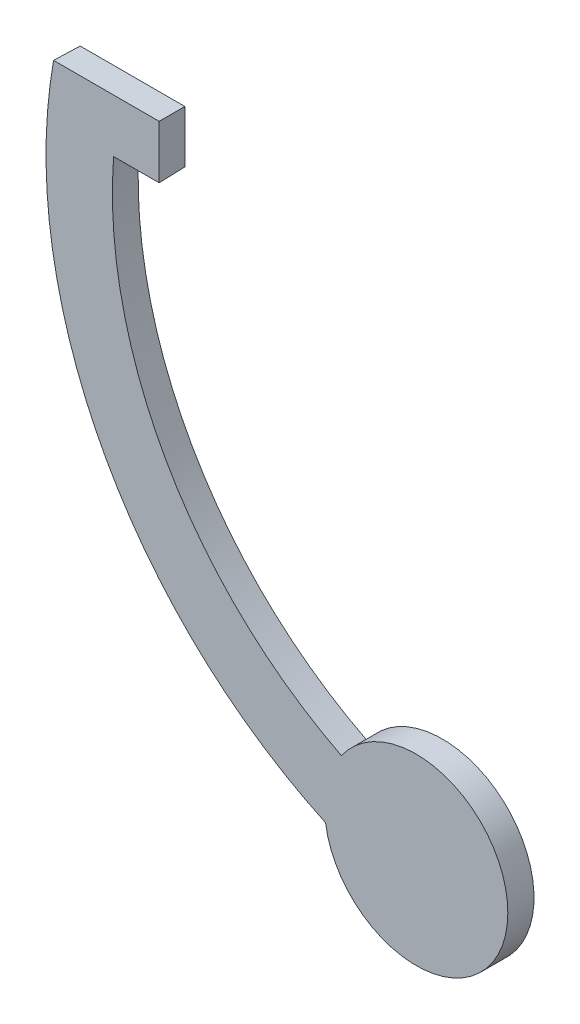
ISO-10303-21;
HEADER;
FILE_DESCRIPTION(('STEP AP214'),'2;1');
FILE_NAME('part.step','',(''),(''),'','','');
FILE_SCHEMA(('AUTOMOTIVE_DESIGN { 1 0 10303 214 1 1 1 1 }'));
ENDSEC;
DATA;
#1=APPLICATION_CONTEXT('core data for automotive mechanical design processes');
#2=APPLICATION_PROTOCOL_DEFINITION('international standard','automotive_design',2000,#1);
#3=PRODUCT_CONTEXT('',#1,'mechanical');
#4=PRODUCT('Part','Part','',(#3));
#5=PRODUCT_RELATED_PRODUCT_CATEGORY('part','',(#4));
#6=PRODUCT_DEFINITION_FORMATION('','',#4);
#7=PRODUCT_DEFINITION_CONTEXT('part definition',#1,'design');
#8=PRODUCT_DEFINITION('design','',#6,#7);
#9=PRODUCT_DEFINITION_SHAPE('','',#8);
#10=(LENGTH_UNIT() NAMED_UNIT(*) SI_UNIT(.MILLI.,.METRE.));
#11=(NAMED_UNIT(*) PLANE_ANGLE_UNIT() SI_UNIT($,.RADIAN.));
#12=(NAMED_UNIT(*) SI_UNIT($,.STERADIAN.) SOLID_ANGLE_UNIT());
#13=UNCERTAINTY_MEASURE_WITH_UNIT(LENGTH_MEASURE(1.E-05),#10,'distance_accuracy_value','');
#14=(GEOMETRIC_REPRESENTATION_CONTEXT(3) GLOBAL_UNCERTAINTY_ASSIGNED_CONTEXT((#13)) GLOBAL_UNIT_ASSIGNED_CONTEXT((#10,
#11,#12)) REPRESENTATION_CONTEXT('',''));
#15=CARTESIAN_POINT('',(0.,0.,0.));
#16=DIRECTION('',(0.,0.,1.));
#17=DIRECTION('',(1.,0.,0.));
#18=AXIS2_PLACEMENT_3D('',#15,#16,#17);
#19=CARTESIAN_POINT('',(0.,0.,2.));
#20=DIRECTION('',(0.,0.,-1.));
#21=DIRECTION('',(-1.,0.,0.));
#22=AXIS2_PLACEMENT_3D('',#19,#20,#21);
#23=CYLINDRICAL_SURFACE('',#22,7.);
#24=CARTESIAN_POINT('',(-5.71587016019037,4.04089449402547,2.0102));
#25=CARTESIAN_POINT('',(-5.71929976298552,4.03604328976432,1.67346670640016));
#26=CARTESIAN_POINT('',(-5.72272253548083,4.03118865982949,1.33673339293358));
#27=CARTESIAN_POINT('',(-5.72955441987175,4.02147254861247,0.66326672626691));
#28=CARTESIAN_POINT('',(-5.73296353176736,4.01661106733029,0.326533373066829));
#29=CARTESIAN_POINT('',(-5.73636581336312,4.01174616037442,-0.0102));
#30=B_SPLINE_CURVE_WITH_KNOTS('',3,(#24,#25,#26,#27,#28,#29),.UNSPECIFIED.,.F.,.F.,(4,2,4),(0.,
1.01035709767087,2.02071419534174),.UNSPECIFIED.);
#31=CARTESIAN_POINT('',(-5.71597404449651,4.04074754502706,2.));
#32=VERTEX_POINT('',#31);
#33=CARTESIAN_POINT('',(-5.73626275249213,4.01189352231232,0.));
#34=VERTEX_POINT('',#33);
#35=EDGE_CURVE('E103',#32,#34,#30,.T.);
#36=ORIENTED_EDGE('',*,*,#35,.F.);
#37=CARTESIAN_POINT('',(0.,0.,2.));
#38=DIRECTION('',(0.,0.,1.));
#39=DIRECTION('',(1.,0.,0.));
#40=AXIS2_PLACEMENT_3D('',#37,#38,#39);
#41=CIRCLE('',#40,7.);
#42=CARTESIAN_POINT('',(-6.9271267917892,-1.00742960571765,2.));
#43=VERTEX_POINT('',#42);
#44=EDGE_CURVE('E11',#32,#43,#41,.F.);
#45=ORIENTED_EDGE('',*,*,#44,.T.);
#46=CARTESIAN_POINT('',(-6.93303358857163,-0.965942679322959,-0.0101999999999998));
#47=CARTESIAN_POINT('',(-6.93206666226335,-0.972883041953001,0.326533590941589));
#48=CARTESIAN_POINT('',(-6.93108841112014,-0.979828033017703,0.663267053079047));
#49=CARTESIAN_POINT('',(-6.92910925916386,-0.993727272016424,1.33673371974571));
#50=CARTESIAN_POINT('',(-6.92810835835079,-1.00068151995044,1.67346692427492));
#51=CARTESIAN_POINT('',(-6.92709613270279,-1.00764039631912,2.0102));
#52=B_SPLINE_CURVE_WITH_KNOTS('',3,(#46,#47,#48,#49,#50,#51),.UNSPECIFIED.,.F.,.F.,(4,2,4),(0.,
1.01041948199419,2.02083896398841),.UNSPECIFIED.);
#53=CARTESIAN_POINT('',(-6.93300429477321,-0.966152911632712,0.));
#54=VERTEX_POINT('',#53);
#55=EDGE_CURVE('E92',#54,#43,#52,.T.);
#56=ORIENTED_EDGE('',*,*,#55,.F.);
#57=CARTESIAN_POINT('',(0.,0.,0.));
#58=DIRECTION('',(0.,0.,1.));
#59=DIRECTION('',(1.,0.,0.));
#60=AXIS2_PLACEMENT_3D('',#57,#58,#59);
#61=CIRCLE('',#60,7.);
#62=EDGE_CURVE('E39',#34,#54,#61,.F.);
#63=ORIENTED_EDGE('',*,*,#62,.F.);
#64=EDGE_LOOP('',(#36,#45,#56,#63));
#65=FACE_BOUND('',#64,.T.);
#66=ADVANCED_FACE('F35',(#65),#23,.T.);
#67=CARTESIAN_POINT('',(0.,0.,2.));
#68=DIRECTION('',(0.,0.,1.));
#69=DIRECTION('',(1.,0.,0.));
#70=AXIS2_PLACEMENT_3D('',#67,#68,#69);
#71=PLANE('',#70);
#72=ORIENTED_EDGE('',*,*,#44,.F.);
#73=CARTESIAN_POINT('',(8.72574402118636,32.5283518673079,2.));
#74=DIRECTION('',(0.,0.,-1.));
#75=DIRECTION('',(-1.,0.,0.));
#76=AXIS2_PLACEMENT_3D('',#73,#74,#75);
#77=CIRCLE('',#76,31.9391111446688);
#78=CARTESIAN_POINT('',(-23.1193658760264,34.9769833924559,2.));
#79=VERTEX_POINT('',#78);
#80=EDGE_CURVE('E57',#79,#32,#77,.F.);
#81=ORIENTED_EDGE('',*,*,#80,.F.);
#82=DIRECTION('',(-1.,0.,0.));
#83=VECTOR('',#82,1.);
#84=CARTESIAN_POINT('',(0.,34.9769833924559,2.));
#85=LINE('',#84,#83);
#86=CARTESIAN_POINT('',(-19.6404713372833,34.9769833924559,2.));
#87=VERTEX_POINT('',#86);
#88=EDGE_CURVE('E226',#87,#79,#85,.T.);
#89=ORIENTED_EDGE('',*,*,#88,.F.);
#90=DIRECTION('',(0.,-1.,0.));
#91=VECTOR('',#90,1.);
#92=CARTESIAN_POINT('',(-19.6404713372833,0.,2.));
#93=LINE('',#92,#91);
#94=CARTESIAN_POINT('',(-19.6404713372833,39.0468036521688,2.));
#95=VERTEX_POINT('',#94);
#96=EDGE_CURVE('E223',#95,#87,#93,.T.);
#97=ORIENTED_EDGE('',*,*,#96,.F.);
#98=DIRECTION('',(1.,0.,0.));
#99=VECTOR('',#98,1.);
#100=CARTESIAN_POINT('',(0.,39.0468036521688,2.));
#101=LINE('',#100,#99);
#102=CARTESIAN_POINT('',(-27.7046113163981,39.0468036521688,2.));
#103=VERTEX_POINT('',#102);
#104=EDGE_CURVE('E227',#103,#95,#101,.T.);
#105=ORIENTED_EDGE('',*,*,#104,.F.);
#106=CARTESIAN_POINT('',(8.72574402118636,32.5283518673079,2.));
#107=DIRECTION('',(0.,0.,-1.));
#108=DIRECTION('',(-1.,0.,0.));
#109=AXIS2_PLACEMENT_3D('',#106,#107,#108);
#110=CIRCLE('',#109,37.0089314043816);
#111=EDGE_CURVE('E215',#43,#103,#110,.T.);
#112=ORIENTED_EDGE('',*,*,#111,.F.);
#113=EDGE_LOOP('',(#72,#81,#89,#97,#105,#112));
#114=FACE_BOUND('',#113,.T.);
#115=ADVANCED_FACE('F147',(#114),#71,.T.);
#116=CARTESIAN_POINT('',(0.,0.,0.));
#117=DIRECTION('',(0.,0.,1.));
#118=DIRECTION('',(1.,0.,0.));
#119=AXIS2_PLACEMENT_3D('',#116,#117,#118);
#120=PLANE('',#119);
#121=ORIENTED_EDGE('',*,*,#62,.T.);
#122=CARTESIAN_POINT('',(8.72574402118636,32.5283518673079,0.));
#123=DIRECTION('',(0.,0.,-1.));
#124=DIRECTION('',(-1.,0.,0.));
#125=AXIS2_PLACEMENT_3D('',#122,#123,#124);
#126=CIRCLE('',#125,36.9740212745252);
#127=CARTESIAN_POINT('',(-27.6753814671398,39.0118935223123,0.));
#128=VERTEX_POINT('',#127);
#129=EDGE_CURVE('E89',#54,#128,#126,.T.);
#130=ORIENTED_EDGE('',*,*,#129,.T.);
#131=DIRECTION('',(1.,0.,0.));
#132=VECTOR('',#131,1.);
#133=CARTESIAN_POINT('',(-27.6753814671398,39.0118935223123,0.));
#134=LINE('',#133,#132);
#135=CARTESIAN_POINT('',(-19.6753814671398,39.0118935223123,0.));
#136=VERTEX_POINT('',#135);
#137=EDGE_CURVE('E98',#128,#136,#134,.T.);
#138=ORIENTED_EDGE('',*,*,#137,.T.);
#139=DIRECTION('',(0.,-1.,0.));
#140=VECTOR('',#139,1.);
#141=CARTESIAN_POINT('',(-19.6753814671398,39.0118935223123,0.));
#142=LINE('',#141,#140);
#143=CARTESIAN_POINT('',(-19.6753814671398,35.0118935223123,0.));
#144=VERTEX_POINT('',#143);
#145=EDGE_CURVE('E208',#136,#144,#142,.T.);
#146=ORIENTED_EDGE('',*,*,#145,.T.);
#147=DIRECTION('',(-1.,0.,0.));
#148=VECTOR('',#147,1.);
#149=CARTESIAN_POINT('',(-19.6753814671398,35.0118935223123,0.));
#150=LINE('',#149,#148);
#151=CARTESIAN_POINT('',(-23.1516783544018,35.0118935223123,0.));
#152=VERTEX_POINT('',#151);
#153=EDGE_CURVE('E210',#144,#152,#150,.T.);
#154=ORIENTED_EDGE('',*,*,#153,.T.);
#155=CARTESIAN_POINT('',(8.72574402118636,32.5283518673079,0.));
#156=DIRECTION('',(0.,0.,1.));
#157=DIRECTION('',(1.,0.,0.));
#158=AXIS2_PLACEMENT_3D('',#155,#156,#157);
#159=CIRCLE('',#158,31.9740212745252);
#160=EDGE_CURVE('E50',#152,#34,#159,.T.);
#161=ORIENTED_EDGE('',*,*,#160,.T.);
#162=EDGE_LOOP('',(#121,#130,#138,#146,#154,#161));
#163=FACE_BOUND('',#162,.T.);
#164=ADVANCED_FACE('F106',(#163),#120,.F.);
#165=CARTESIAN_POINT('',(8.72574402118636,32.5283518673079,0.));
#166=DIRECTION('',(0.,0.,-1.));
#167=DIRECTION('',(1.,0.,0.));
#168=AXIS2_PLACEMENT_3D('',#165,#166,#167);
#169=CONICAL_SURFACE('',#168,31.9740212745252,0.0174532925199432);
#170=ORIENTED_EDGE('',*,*,#80,.T.);
#171=ORIENTED_EDGE('',*,*,#35,.T.);
#172=ORIENTED_EDGE('',*,*,#160,.F.);
#173=CARTESIAN_POINT('',(-23.1193658760264,34.9769833924559,2.));
#174=CARTESIAN_POINT('',(-23.1247540192164,34.9828017466623,1.66666671076182));
#175=CARTESIAN_POINT('',(-23.1301407973427,34.9886201012535,1.33333339947606));
#176=CARTESIAN_POINT('',(-23.1409116234679,35.0002568112056,0.666666732809397));
#177=CARTESIAN_POINT('',(-23.1462956714667,35.0060751665666,0.333333377428488));
#178=CARTESIAN_POINT('',(-23.1516783544018,35.0118935223123,0.));
#179=B_SPLINE_CURVE_WITH_KNOTS('',3,(#173,#174,#175,#176,#177,#178),.UNSPECIFIED.,.F.,.F.,(4,2,
4),(0.,1.00028281169534,2.00056562339066),.UNSPECIFIED.);
#180=EDGE_CURVE('E104',#79,#152,#179,.T.);
#181=ORIENTED_EDGE('',*,*,#180,.F.);
#182=EDGE_LOOP('',(#170,#171,#172,#181));
#183=FACE_BOUND('',#182,.T.);
#184=ADVANCED_FACE('F119',(#183),#169,.F.);
#185=CARTESIAN_POINT('',(-19.6753814671398,35.0118935223123,0.));
#186=DIRECTION('',(0.,-0.999847695156391,-0.0174524064372835));
#187=DIRECTION('',(0.,0.0174524064372835,-0.999847695156391));
#188=AXIS2_PLACEMENT_3D('',#185,#186,#187);
#189=PLANE('',#188);
#190=ORIENTED_EDGE('',*,*,#153,.F.);
#191=DIRECTION('',(-0.0174497491606826,0.0174497491606826,-0.999695459881887));
#192=VECTOR('',#191,1.);
#193=CARTESIAN_POINT('',(-19.6765994421228,35.0131114972954,-0.0697777400480487));
#194=LINE('',#193,#192);
#195=EDGE_CURVE('E134',#87,#144,#194,.T.);
#196=ORIENTED_EDGE('',*,*,#195,.F.);
#197=ORIENTED_EDGE('',*,*,#88,.T.);
#198=ORIENTED_EDGE('',*,*,#180,.T.);
#199=EDGE_LOOP('',(#190,#196,#197,#198));
#200=FACE_BOUND('',#199,.T.);
#201=ADVANCED_FACE('F122',(#200),#189,.T.);
#202=CARTESIAN_POINT('',(-19.6753814671398,39.0118935223123,0.));
#203=DIRECTION('',(0.999847695156391,0.,-0.0174524064372835));
#204=DIRECTION('',(-0.0174524064372835,0.,-0.999847695156391));
#205=AXIS2_PLACEMENT_3D('',#202,#203,#204);
#206=PLANE('',#205);
#207=ORIENTED_EDGE('',*,*,#145,.F.);
#208=DIRECTION('',(-0.0174497491606826,-0.0174497491606826,-0.999695459881887));
#209=VECTOR('',#208,1.);
#210=CARTESIAN_POINT('',(-19.6778174171059,39.0094575723462,-0.139555480096098));
#211=LINE('',#210,#209);
#212=EDGE_CURVE('E205',#95,#136,#211,.T.);
#213=ORIENTED_EDGE('',*,*,#212,.F.);
#214=ORIENTED_EDGE('',*,*,#96,.T.);
#215=ORIENTED_EDGE('',*,*,#195,.T.);
#216=EDGE_LOOP('',(#207,#213,#214,#215));
#217=FACE_BOUND('',#216,.T.);
#218=ADVANCED_FACE('F140',(#217),#206,.T.);
#219=CARTESIAN_POINT('',(-27.6753814671398,39.0118935223123,0.));
#220=DIRECTION('',(0.,0.999847695156391,-0.0174524064372835));
#221=DIRECTION('',(0.,0.0174524064372835,0.999847695156391));
#222=AXIS2_PLACEMENT_3D('',#219,#220,#221);
#223=PLANE('',#222);
#224=ORIENTED_EDGE('',*,*,#137,.F.);
#225=CARTESIAN_POINT('',(-27.7046113163981,39.0468036521688,2.));
#226=CARTESIAN_POINT('',(-27.6997416295996,39.0409852966942,1.66666663810693));
#227=CARTESIAN_POINT('',(-27.6948709654289,39.0351669414688,1.33333329049372));
#228=CARTESIAN_POINT('',(-27.6851276823428,39.0235302315167,0.666666623827055));
#229=CARTESIAN_POINT('',(-27.6802550634274,39.0177118767899,0.333333304773592));
#230=CARTESIAN_POINT('',(-27.6753814671398,39.0118935223123,0.));
#231=B_SPLINE_CURVE_WITH_KNOTS('',3,(#225,#226,#227,#228,#229,#230),.UNSPECIFIED.,.F.,.F.,(4,2,
4),(0.,1.00025910409361,2.00051820818723),.UNSPECIFIED.);
#232=EDGE_CURVE('E95',#103,#128,#231,.T.);
#233=ORIENTED_EDGE('',*,*,#232,.F.);
#234=ORIENTED_EDGE('',*,*,#104,.T.);
#235=ORIENTED_EDGE('',*,*,#212,.T.);
#236=EDGE_LOOP('',(#224,#233,#234,#235));
#237=FACE_BOUND('',#236,.T.);
#238=ADVANCED_FACE('F142',(#237),#223,.T.);
#239=CARTESIAN_POINT('',(8.72574402118636,32.5283518673079,0.));
#240=DIRECTION('',(0.,0.,1.));
#241=DIRECTION('',(-1.,0.,0.));
#242=AXIS2_PLACEMENT_3D('',#239,#240,#241);
#243=CONICAL_SURFACE('',#242,36.9740212745252,0.0174532925199432);
#244=ORIENTED_EDGE('',*,*,#129,.F.);
#245=ORIENTED_EDGE('',*,*,#55,.T.);
#246=ORIENTED_EDGE('',*,*,#111,.T.);
#247=ORIENTED_EDGE('',*,*,#232,.T.);
#248=EDGE_LOOP('',(#244,#245,#246,#247));
#249=FACE_BOUND('',#248,.T.);
#250=ADVANCED_FACE('F91',(#249),#243,.T.);
#251=CLOSED_SHELL('',(#66,#115,#164,#184,#201,#218,#238,#250));
#252=MANIFOLD_SOLID_BREP('B2',#251);
#253=ADVANCED_BREP_SHAPE_REPRESENTATION('',(#18,#252),#14);
#254=SHAPE_DEFINITION_REPRESENTATION(#9,#253);
ENDSEC;
END-ISO-10303-21;
